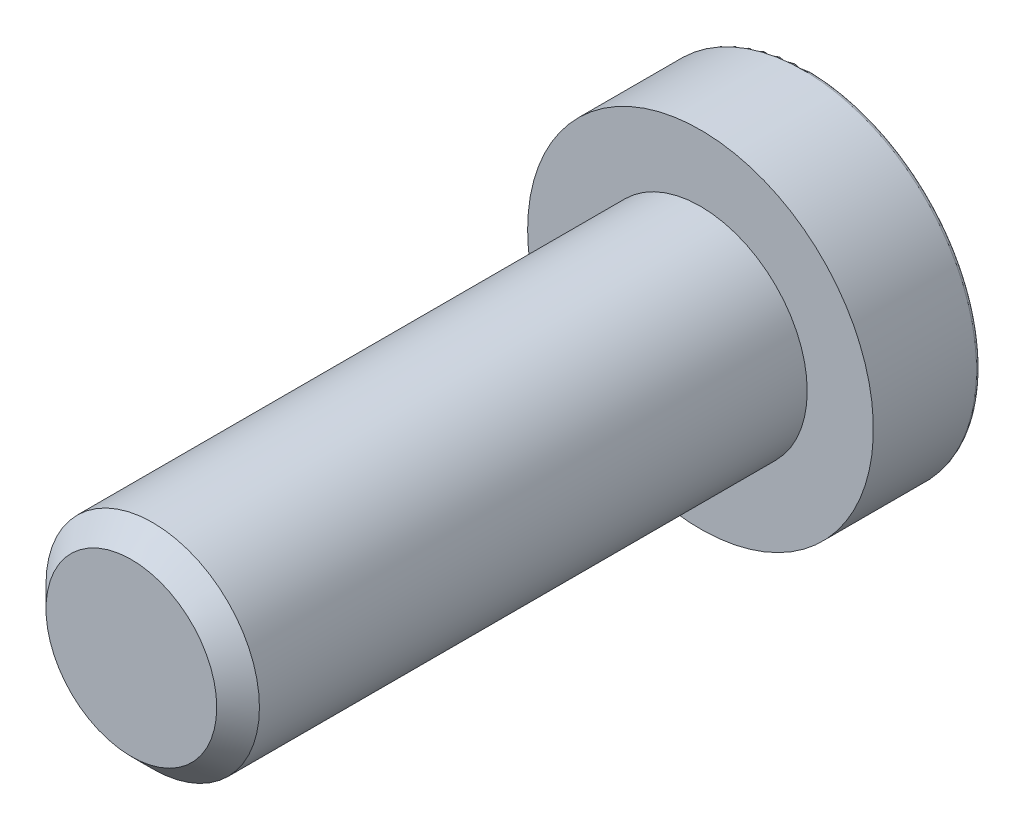
ISO-10303-21;
HEADER;
FILE_DESCRIPTION(('STEP AP214'),'2;1');
FILE_NAME('part.step','',(''),(''),'','','');
FILE_SCHEMA(('AUTOMOTIVE_DESIGN { 1 0 10303 214 1 1 1 1 }'));
ENDSEC;
DATA;
#1=APPLICATION_CONTEXT('core data for automotive mechanical design processes');
#2=APPLICATION_PROTOCOL_DEFINITION('international standard','automotive_design',2000,#1);
#3=PRODUCT_CONTEXT('',#1,'mechanical');
#4=PRODUCT('Part','Part','',(#3));
#5=PRODUCT_RELATED_PRODUCT_CATEGORY('part','',(#4));
#6=PRODUCT_DEFINITION_FORMATION('','',#4);
#7=PRODUCT_DEFINITION_CONTEXT('part definition',#1,'design');
#8=PRODUCT_DEFINITION('design','',#6,#7);
#9=PRODUCT_DEFINITION_SHAPE('','',#8);
#10=(LENGTH_UNIT() NAMED_UNIT(*) SI_UNIT(.MILLI.,.METRE.));
#11=(NAMED_UNIT(*) PLANE_ANGLE_UNIT() SI_UNIT($,.RADIAN.));
#12=(NAMED_UNIT(*) SI_UNIT($,.STERADIAN.) SOLID_ANGLE_UNIT());
#13=UNCERTAINTY_MEASURE_WITH_UNIT(LENGTH_MEASURE(1.E-05),#10,'distance_accuracy_value','');
#14=(GEOMETRIC_REPRESENTATION_CONTEXT(3) GLOBAL_UNCERTAINTY_ASSIGNED_CONTEXT((#13)) GLOBAL_UNIT_ASSIGNED_CONTEXT((#10,
#11,#12)) REPRESENTATION_CONTEXT('',''));
#15=CARTESIAN_POINT('',(0.,0.,0.));
#16=DIRECTION('',(0.,0.,1.));
#17=DIRECTION('',(1.,0.,0.));
#18=AXIS2_PLACEMENT_3D('',#15,#16,#17);
#19=CARTESIAN_POINT('',(0.,0.,-1.5));
#20=DIRECTION('',(0.,0.,1.));
#21=DIRECTION('',(1.,0.,0.));
#22=AXIS2_PLACEMENT_3D('',#19,#20,#21);
#23=PLANE('',#22);
#24=CARTESIAN_POINT('',(0.,0.,-1.5));
#25=DIRECTION('',(0.,0.,-1.));
#26=DIRECTION('',(-1.,0.,0.));
#27=AXIS2_PLACEMENT_3D('',#24,#25,#26);
#28=CIRCLE('',#27,2.38);
#29=CARTESIAN_POINT('',(-2.38,0.,-1.5));
#30=VERTEX_POINT('',#29);
#31=EDGE_CURVE('E149',#30,#30,#28,.T.);
#32=ORIENTED_EDGE('',*,*,#31,.T.);
#33=EDGE_LOOP('',(#32));
#34=FACE_BOUND('',#33,.T.);
#35=DIRECTION('',(-0.866025403784445,0.499999999999988,0.));
#36=VECTOR('',#35,1.);
#37=CARTESIAN_POINT('',(0.,1.18459758832365,-1.5));
#38=LINE('',#37,#36);
#39=CARTESIAN_POINT('',(1.02589160475005,0.59229879416183,-1.5));
#40=VERTEX_POINT('',#39);
#41=CARTESIAN_POINT('',(0.,1.18459758832365,-1.5));
#42=VERTEX_POINT('',#41);
#43=EDGE_CURVE('E51',#40,#42,#38,.T.);
#44=ORIENTED_EDGE('',*,*,#43,.T.);
#45=DIRECTION('',(-0.866025403784439,-0.5,0.));
#46=VECTOR('',#45,1.);
#47=CARTESIAN_POINT('',(0.,1.18459758832365,-1.5));
#48=LINE('',#47,#46);
#49=CARTESIAN_POINT('',(-1.02589160475005,0.59229879416184,-1.5));
#50=VERTEX_POINT('',#49);
#51=EDGE_CURVE('E122',#42,#50,#48,.T.);
#52=ORIENTED_EDGE('',*,*,#51,.T.);
#53=DIRECTION('',(0.,-1.,0.));
#54=VECTOR('',#53,1.);
#55=CARTESIAN_POINT('',(-1.02589160475005,-0.59229879416184,-1.5));
#56=LINE('',#55,#54);
#57=CARTESIAN_POINT('',(-1.02589160475005,-0.59229879416184,-1.5));
#58=VERTEX_POINT('',#57);
#59=EDGE_CURVE('E126',#50,#58,#56,.T.);
#60=ORIENTED_EDGE('',*,*,#59,.T.);
#61=DIRECTION('',(0.866025403784439,-0.5,0.));
#62=VECTOR('',#61,1.);
#63=CARTESIAN_POINT('',(0.,-1.18459758832365,-1.5));
#64=LINE('',#63,#62);
#65=CARTESIAN_POINT('',(0.,-1.18459758832365,-1.5));
#66=VERTEX_POINT('',#65);
#67=EDGE_CURVE('E129',#58,#66,#64,.T.);
#68=ORIENTED_EDGE('',*,*,#67,.T.);
#69=DIRECTION('',(0.866025403784449,0.499999999999982,0.));
#70=VECTOR('',#69,1.);
#71=CARTESIAN_POINT('',(0.,-1.18459758832365,-1.5));
#72=LINE('',#71,#70);
#73=CARTESIAN_POINT('',(1.02589160475005,-0.59229879416184,-1.5));
#74=VERTEX_POINT('',#73);
#75=EDGE_CURVE('E112',#66,#74,#72,.T.);
#76=ORIENTED_EDGE('',*,*,#75,.T.);
#77=DIRECTION('',(0.,1.,0.));
#78=VECTOR('',#77,1.);
#79=CARTESIAN_POINT('',(1.02589160475005,-0.59229879416184,-1.5));
#80=LINE('',#79,#78);
#81=EDGE_CURVE('E132',#74,#40,#80,.T.);
#82=ORIENTED_EDGE('',*,*,#81,.T.);
#83=EDGE_LOOP('',(#44,#52,#60,#68,#76,#82));
#84=FACE_BOUND('',#83,.T.);
#85=ADVANCED_FACE('F36',(#34,#84),#23,.F.);
#86=CARTESIAN_POINT('',(0.,0.,-1.45));
#87=DIRECTION('',(0.,0.,-1.));
#88=DIRECTION('',(-1.,0.,0.));
#89=AXIS2_PLACEMENT_3D('',#86,#87,#88);
#90=TOROIDAL_SURFACE('',#89,2.38,0.0500000000000003);
#91=ORIENTED_EDGE('',*,*,#31,.F.);
#92=EDGE_LOOP('',(#91));
#93=FACE_BOUND('',#92,.T.);
#94=CARTESIAN_POINT('',(0.,0.,-1.45));
#95=DIRECTION('',(0.,0.,-1.));
#96=DIRECTION('',(-1.,0.,0.));
#97=AXIS2_PLACEMENT_3D('',#94,#95,#96);
#98=CIRCLE('',#97,2.43);
#99=CARTESIAN_POINT('',(-2.43,0.,-1.45));
#100=VERTEX_POINT('',#99);
#101=EDGE_CURVE('E146',#100,#100,#98,.T.);
#102=ORIENTED_EDGE('',*,*,#101,.T.);
#103=EDGE_LOOP('',(#102));
#104=FACE_BOUND('',#103,.T.);
#105=ADVANCED_FACE('F166',(#93,#104),#90,.T.);
#106=CARTESIAN_POINT('',(0.,0.,0.));
#107=DIRECTION('',(0.,0.,-1.));
#108=DIRECTION('',(-1.,0.,0.));
#109=AXIS2_PLACEMENT_3D('',#106,#107,#108);
#110=CYLINDRICAL_SURFACE('',#109,2.43);
#111=ORIENTED_EDGE('',*,*,#101,.F.);
#112=EDGE_LOOP('',(#111));
#113=FACE_BOUND('',#112,.T.);
#114=CARTESIAN_POINT('',(0.,0.,0.));
#115=DIRECTION('',(0.,0.,-1.));
#116=DIRECTION('',(-1.,0.,0.));
#117=AXIS2_PLACEMENT_3D('',#114,#115,#116);
#118=CIRCLE('',#117,2.43);
#119=CARTESIAN_POINT('',(-2.43,0.,0.));
#120=VERTEX_POINT('',#119);
#121=EDGE_CURVE('E143',#120,#120,#118,.T.);
#122=ORIENTED_EDGE('',*,*,#121,.T.);
#123=EDGE_LOOP('',(#122));
#124=FACE_BOUND('',#123,.T.);
#125=ADVANCED_FACE('F171',(#113,#124),#110,.T.);
#126=CARTESIAN_POINT('',(0.,0.,0.));
#127=DIRECTION('',(0.,0.,-1.));
#128=DIRECTION('',(-1.,0.,0.));
#129=AXIS2_PLACEMENT_3D('',#126,#127,#128);
#130=PLANE('',#129);
#131=CARTESIAN_POINT('',(0.,0.,0.));
#132=DIRECTION('',(0.,0.,1.));
#133=DIRECTION('',(1.,0.,0.));
#134=AXIS2_PLACEMENT_3D('',#131,#132,#133);
#135=CIRCLE('',#134,1.5);
#136=CARTESIAN_POINT('',(1.5,0.,0.));
#137=VERTEX_POINT('',#136);
#138=EDGE_CURVE('E123',#137,#137,#135,.T.);
#139=ORIENTED_EDGE('',*,*,#138,.F.);
#140=EDGE_LOOP('',(#139));
#141=FACE_BOUND('',#140,.T.);
#142=ORIENTED_EDGE('',*,*,#121,.F.);
#143=EDGE_LOOP('',(#142));
#144=FACE_BOUND('',#143,.T.);
#145=ADVANCED_FACE('F178',(#141,#144),#130,.F.);
#146=CARTESIAN_POINT('',(0.,1.18459758832365,-0.2));
#147=DIRECTION('',(-0.499999999999988,-0.866025403784445,0.));
#148=DIRECTION('',(0.866025403784445,-0.499999999999988,0.));
#149=AXIS2_PLACEMENT_3D('',#146,#147,#148);
#150=PLANE('',#149);
#151=ORIENTED_EDGE('',*,*,#43,.F.);
#152=DIRECTION('',(0.,0.,-1.));
#153=VECTOR('',#152,1.);
#154=CARTESIAN_POINT('',(1.02589160475005,0.59229879416183,-0.2));
#155=LINE('',#154,#153);
#156=CARTESIAN_POINT('',(1.02589160475005,0.59229879416183,-0.2));
#157=VERTEX_POINT('',#156);
#158=EDGE_CURVE('E117',#157,#40,#155,.T.);
#159=ORIENTED_EDGE('',*,*,#158,.F.);
#160=DIRECTION('',(-0.866025403784445,0.499999999999988,0.));
#161=VECTOR('',#160,1.);
#162=CARTESIAN_POINT('',(0.,1.18459758832365,-0.2));
#163=LINE('',#162,#161);
#164=CARTESIAN_POINT('',(0.,1.18459758832365,-0.2));
#165=VERTEX_POINT('',#164);
#166=EDGE_CURVE('E135',#157,#165,#163,.T.);
#167=ORIENTED_EDGE('',*,*,#166,.T.);
#168=DIRECTION('',(0.,0.,-1.));
#169=VECTOR('',#168,1.);
#170=CARTESIAN_POINT('',(0.,1.18459758832365,-0.2));
#171=LINE('',#170,#169);
#172=EDGE_CURVE('E141',#165,#42,#171,.T.);
#173=ORIENTED_EDGE('',*,*,#172,.T.);
#174=EDGE_LOOP('',(#151,#159,#167,#173));
#175=FACE_BOUND('',#174,.T.);
#176=ADVANCED_FACE('F182',(#175),#150,.T.);
#177=CARTESIAN_POINT('',(0.,1.18459758832365,-0.2));
#178=DIRECTION('',(0.5,-0.866025403784439,0.));
#179=DIRECTION('',(0.866025403784439,0.5,0.));
#180=AXIS2_PLACEMENT_3D('',#177,#178,#179);
#181=PLANE('',#180);
#182=ORIENTED_EDGE('',*,*,#51,.F.);
#183=ORIENTED_EDGE('',*,*,#172,.F.);
#184=DIRECTION('',(-0.866025403784439,-0.5,0.));
#185=VECTOR('',#184,1.);
#186=CARTESIAN_POINT('',(0.,1.18459758832365,-0.2));
#187=LINE('',#186,#185);
#188=CARTESIAN_POINT('',(-1.02589160475005,0.59229879416184,-0.2));
#189=VERTEX_POINT('',#188);
#190=EDGE_CURVE('E90',#165,#189,#187,.T.);
#191=ORIENTED_EDGE('',*,*,#190,.T.);
#192=DIRECTION('',(0.,0.,-1.));
#193=VECTOR('',#192,1.);
#194=CARTESIAN_POINT('',(-1.02589160475005,0.59229879416184,-0.2));
#195=LINE('',#194,#193);
#196=EDGE_CURVE('E139',#189,#50,#195,.T.);
#197=ORIENTED_EDGE('',*,*,#196,.T.);
#198=EDGE_LOOP('',(#182,#183,#191,#197));
#199=FACE_BOUND('',#198,.T.);
#200=ADVANCED_FACE('F186',(#199),#181,.T.);
#201=CARTESIAN_POINT('',(-1.02589160475005,-0.59229879416184,-0.2));
#202=DIRECTION('',(1.,0.,0.));
#203=DIRECTION('',(0.,0.,-1.));
#204=AXIS2_PLACEMENT_3D('',#201,#202,#203);
#205=PLANE('',#204);
#206=ORIENTED_EDGE('',*,*,#59,.F.);
#207=ORIENTED_EDGE('',*,*,#196,.F.);
#208=DIRECTION('',(0.,-1.,0.));
#209=VECTOR('',#208,1.);
#210=CARTESIAN_POINT('',(-1.02589160475005,-0.59229879416184,-0.2));
#211=LINE('',#210,#209);
#212=CARTESIAN_POINT('',(-1.02589160475005,-0.59229879416184,-0.2));
#213=VERTEX_POINT('',#212);
#214=EDGE_CURVE('E108',#189,#213,#211,.T.);
#215=ORIENTED_EDGE('',*,*,#214,.T.);
#216=DIRECTION('',(0.,0.,-1.));
#217=VECTOR('',#216,1.);
#218=CARTESIAN_POINT('',(-1.02589160475005,-0.59229879416184,-0.2));
#219=LINE('',#218,#217);
#220=EDGE_CURVE('E105',#213,#58,#219,.T.);
#221=ORIENTED_EDGE('',*,*,#220,.T.);
#222=EDGE_LOOP('',(#206,#207,#215,#221));
#223=FACE_BOUND('',#222,.T.);
#224=ADVANCED_FACE('F189',(#223),#205,.T.);
#225=CARTESIAN_POINT('',(0.,-1.18459758832365,-0.2));
#226=DIRECTION('',(0.5,0.866025403784439,0.));
#227=DIRECTION('',(-0.866025403784439,0.5,0.));
#228=AXIS2_PLACEMENT_3D('',#225,#226,#227);
#229=PLANE('',#228);
#230=ORIENTED_EDGE('',*,*,#67,.F.);
#231=ORIENTED_EDGE('',*,*,#220,.F.);
#232=DIRECTION('',(0.866025403784439,-0.5,0.));
#233=VECTOR('',#232,1.);
#234=CARTESIAN_POINT('',(0.,-1.18459758832365,-0.2));
#235=LINE('',#234,#233);
#236=CARTESIAN_POINT('',(0.,-1.18459758832365,-0.2));
#237=VERTEX_POINT('',#236);
#238=EDGE_CURVE('E100',#213,#237,#235,.T.);
#239=ORIENTED_EDGE('',*,*,#238,.T.);
#240=DIRECTION('',(0.,0.,-1.));
#241=VECTOR('',#240,1.);
#242=CARTESIAN_POINT('',(0.,-1.18459758832365,-0.2));
#243=LINE('',#242,#241);
#244=EDGE_CURVE('E104',#237,#66,#243,.T.);
#245=ORIENTED_EDGE('',*,*,#244,.T.);
#246=EDGE_LOOP('',(#230,#231,#239,#245));
#247=FACE_BOUND('',#246,.T.);
#248=ADVANCED_FACE('F103',(#247),#229,.T.);
#249=CARTESIAN_POINT('',(0.,-1.18459758832365,-0.2));
#250=DIRECTION('',(-0.499999999999982,0.866025403784449,0.));
#251=DIRECTION('',(-0.866025403784449,-0.499999999999982,0.));
#252=AXIS2_PLACEMENT_3D('',#249,#250,#251);
#253=PLANE('',#252);
#254=ORIENTED_EDGE('',*,*,#75,.F.);
#255=ORIENTED_EDGE('',*,*,#244,.F.);
#256=DIRECTION('',(0.866025403784449,0.499999999999982,0.));
#257=VECTOR('',#256,1.);
#258=CARTESIAN_POINT('',(0.,-1.18459758832365,-0.2));
#259=LINE('',#258,#257);
#260=CARTESIAN_POINT('',(1.02589160475005,-0.59229879416184,-0.2));
#261=VERTEX_POINT('',#260);
#262=EDGE_CURVE('E107',#237,#261,#259,.T.);
#263=ORIENTED_EDGE('',*,*,#262,.T.);
#264=DIRECTION('',(0.,0.,-1.));
#265=VECTOR('',#264,1.);
#266=CARTESIAN_POINT('',(1.02589160475005,-0.59229879416184,-0.2));
#267=LINE('',#266,#265);
#268=EDGE_CURVE('E81',#261,#74,#267,.T.);
#269=ORIENTED_EDGE('',*,*,#268,.T.);
#270=EDGE_LOOP('',(#254,#255,#263,#269));
#271=FACE_BOUND('',#270,.T.);
#272=ADVANCED_FACE('F110',(#271),#253,.T.);
#273=CARTESIAN_POINT('',(1.02589160475005,-0.59229879416184,-0.2));
#274=DIRECTION('',(-1.,0.,0.));
#275=DIRECTION('',(0.,-1.,0.));
#276=AXIS2_PLACEMENT_3D('',#273,#274,#275);
#277=PLANE('',#276);
#278=ORIENTED_EDGE('',*,*,#81,.F.);
#279=ORIENTED_EDGE('',*,*,#268,.F.);
#280=DIRECTION('',(0.,1.,0.));
#281=VECTOR('',#280,1.);
#282=CARTESIAN_POINT('',(1.02589160475005,-0.59229879416184,-0.2));
#283=LINE('',#282,#281);
#284=EDGE_CURVE('E59',#261,#157,#283,.T.);
#285=ORIENTED_EDGE('',*,*,#284,.T.);
#286=ORIENTED_EDGE('',*,*,#158,.T.);
#287=EDGE_LOOP('',(#278,#279,#285,#286));
#288=FACE_BOUND('',#287,.T.);
#289=ADVANCED_FACE('F198',(#288),#277,.T.);
#290=CARTESIAN_POINT('',(1.02589160475005,0.59229879416183,-0.2));
#291=DIRECTION('',(0.,0.,1.));
#292=DIRECTION('',(1.,0.,0.));
#293=AXIS2_PLACEMENT_3D('',#290,#291,#292);
#294=PLANE('',#293);
#295=ORIENTED_EDGE('',*,*,#166,.F.);
#296=ORIENTED_EDGE('',*,*,#284,.F.);
#297=ORIENTED_EDGE('',*,*,#262,.F.);
#298=ORIENTED_EDGE('',*,*,#238,.F.);
#299=ORIENTED_EDGE('',*,*,#214,.F.);
#300=ORIENTED_EDGE('',*,*,#190,.F.);
#301=EDGE_LOOP('',(#295,#296,#297,#298,#299,#300));
#302=FACE_BOUND('',#301,.T.);
#303=ADVANCED_FACE('F115',(#302),#294,.F.);
#304=CARTESIAN_POINT('',(0.,0.,8.));
#305=DIRECTION('',(0.,0.,1.));
#306=DIRECTION('',(1.,0.,0.));
#307=AXIS2_PLACEMENT_3D('',#304,#305,#306);
#308=PLANE('',#307);
#309=CARTESIAN_POINT('',(0.,0.,8.));
#310=DIRECTION('',(0.,0.,1.));
#311=DIRECTION('',(1.,0.,0.));
#312=AXIS2_PLACEMENT_3D('',#309,#310,#311);
#313=CIRCLE('',#312,1.2);
#314=CARTESIAN_POINT('',(1.2,0.,8.));
#315=VERTEX_POINT('',#314);
#316=EDGE_CURVE('E44',#315,#315,#313,.T.);
#317=ORIENTED_EDGE('',*,*,#316,.T.);
#318=EDGE_LOOP('',(#317));
#319=FACE_BOUND('',#318,.T.);
#320=ADVANCED_FACE('F154',(#319),#308,.T.);
#321=CARTESIAN_POINT('',(0.,0.,0.));
#322=DIRECTION('',(0.,0.,1.));
#323=DIRECTION('',(1.,0.,0.));
#324=AXIS2_PLACEMENT_3D('',#321,#322,#323);
#325=CYLINDRICAL_SURFACE('',#324,1.5);
#326=CARTESIAN_POINT('',(0.,0.,7.7));
#327=DIRECTION('',(0.,0.,1.));
#328=DIRECTION('',(1.,0.,0.));
#329=AXIS2_PLACEMENT_3D('',#326,#327,#328);
#330=CIRCLE('',#329,1.5);
#331=CARTESIAN_POINT('',(1.5,0.,7.7));
#332=VERTEX_POINT('',#331);
#333=EDGE_CURVE('E11',#332,#332,#330,.F.);
#334=ORIENTED_EDGE('',*,*,#333,.T.);
#335=EDGE_LOOP('',(#334));
#336=FACE_BOUND('',#335,.T.);
#337=ORIENTED_EDGE('',*,*,#138,.T.);
#338=EDGE_LOOP('',(#337));
#339=FACE_BOUND('',#338,.T.);
#340=ADVANCED_FACE('F157',(#336,#339),#325,.T.);
#341=CARTESIAN_POINT('',(0.,0.,8.));
#342=DIRECTION('',(0.,0.,-1.));
#343=DIRECTION('',(-1.,0.,0.));
#344=AXIS2_PLACEMENT_3D('',#341,#342,#343);
#345=CONICAL_SURFACE('',#344,1.2,0.785398163397447);
#346=ORIENTED_EDGE('',*,*,#333,.F.);
#347=EDGE_LOOP('',(#346));
#348=FACE_BOUND('',#347,.T.);
#349=ORIENTED_EDGE('',*,*,#316,.F.);
#350=EDGE_LOOP('',(#349));
#351=FACE_BOUND('',#350,.T.);
#352=ADVANCED_FACE('F38',(#348,#351),#345,.T.);
#353=CLOSED_SHELL('',(#85,#105,#125,#145,#176,#200,#224,#248,#272,#289,#303,#320,#340,#352));
#354=MANIFOLD_SOLID_BREP('B2',#353);
#355=ADVANCED_BREP_SHAPE_REPRESENTATION('',(#18,#354),#14);
#356=SHAPE_DEFINITION_REPRESENTATION(#9,#355);
ENDSEC;
END-ISO-10303-21;
